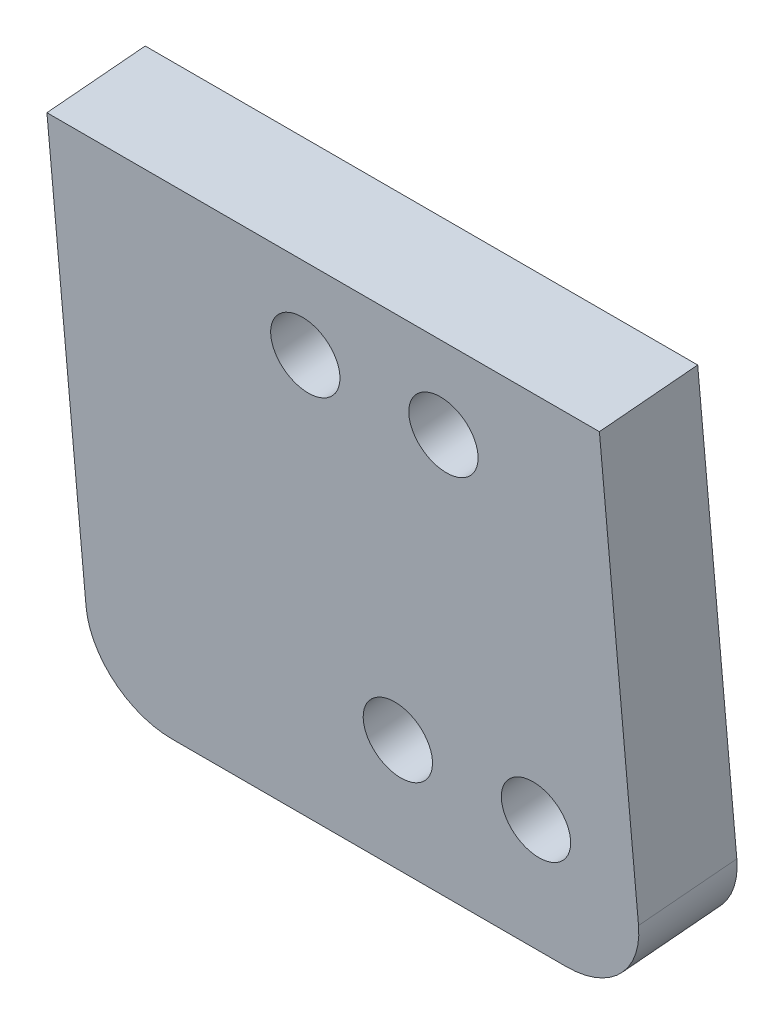
ISO-10303-21;
HEADER;
FILE_DESCRIPTION(('STEP AP214'),'2;1');
FILE_NAME('part.step','',(''),(''),'','','');
FILE_SCHEMA(('AUTOMOTIVE_DESIGN { 1 0 10303 214 1 1 1 1 }'));
ENDSEC;
DATA;
#1=APPLICATION_CONTEXT('core data for automotive mechanical design processes');
#2=APPLICATION_PROTOCOL_DEFINITION('international standard','automotive_design',2000,#1);
#3=PRODUCT_CONTEXT('',#1,'mechanical');
#4=PRODUCT('Part','Part','',(#3));
#5=PRODUCT_RELATED_PRODUCT_CATEGORY('part','',(#4));
#6=PRODUCT_DEFINITION_FORMATION('','',#4);
#7=PRODUCT_DEFINITION_CONTEXT('part definition',#1,'design');
#8=PRODUCT_DEFINITION('design','',#6,#7);
#9=PRODUCT_DEFINITION_SHAPE('','',#8);
#10=(LENGTH_UNIT() NAMED_UNIT(*) SI_UNIT(.MILLI.,.METRE.));
#11=(NAMED_UNIT(*) PLANE_ANGLE_UNIT() SI_UNIT($,.RADIAN.));
#12=(NAMED_UNIT(*) SI_UNIT($,.STERADIAN.) SOLID_ANGLE_UNIT());
#13=UNCERTAINTY_MEASURE_WITH_UNIT(LENGTH_MEASURE(1.E-05),#10,'distance_accuracy_value','');
#14=(GEOMETRIC_REPRESENTATION_CONTEXT(3) GLOBAL_UNCERTAINTY_ASSIGNED_CONTEXT((#13)) GLOBAL_UNIT_ASSIGNED_CONTEXT((#10,
#11,#12)) REPRESENTATION_CONTEXT('',''));
#15=CARTESIAN_POINT('',(0.,0.,0.));
#16=DIRECTION('',(0.,0.,1.));
#17=DIRECTION('',(1.,0.,0.));
#18=AXIS2_PLACEMENT_3D('',#15,#16,#17);
#19=CARTESIAN_POINT('',(-9.39850038185257,-99.6092322077506,29.3696279563749));
#20=DIRECTION('',(0.,0.996194698091746,0.087155742747658));
#21=DIRECTION('',(0.,-0.087155742747658,0.996194698091746));
#22=AXIS2_PLACEMENT_3D('',#19,#20,#21);
#23=PLANE('',#22);
#24=DIRECTION('',(1.,0.,0.));
#25=VECTOR('',#24,1.);
#26=CARTESIAN_POINT('',(-34.0999576101563,-100.480789635227,39.3315749372924));
#27=LINE('',#26,#25);
#28=CARTESIAN_POINT('',(-80.0899576101563,-100.480789635227,39.3315749372924));
#29=VERTEX_POINT('',#28);
#30=CARTESIAN_POINT('',(-24.0999576101563,-100.480789635227,39.3315749372924));
#31=VERTEX_POINT('',#30);
#32=EDGE_CURVE('E119',#29,#31,#27,.T.);
#33=ORIENTED_EDGE('',*,*,#32,.T.);
#34=DIRECTION('',(0.,0.087155742747658,-0.996194698091746));
#35=VECTOR('',#34,1.);
#36=CARTESIAN_POINT('',(-24.0999576101563,-100.480789635227,39.3315749372924));
#37=LINE('',#36,#35);
#38=CARTESIAN_POINT('',(-24.0999576101563,-99.6092322077506,29.3696279563749));
#39=VERTEX_POINT('',#38);
#40=EDGE_CURVE('E116',#31,#39,#37,.T.);
#41=ORIENTED_EDGE('',*,*,#40,.T.);
#42=DIRECTION('',(1.,0.,0.));
#43=VECTOR('',#42,1.);
#44=CARTESIAN_POINT('',(-34.0999576101563,-99.6092322077506,29.3696279563749));
#45=LINE('',#44,#43);
#46=CARTESIAN_POINT('',(-80.0899576101563,-99.6092322077506,29.3696279563749));
#47=VERTEX_POINT('',#46);
#48=EDGE_CURVE('E102',#47,#39,#45,.T.);
#49=ORIENTED_EDGE('',*,*,#48,.F.);
#50=DIRECTION('',(0.,-0.087155742747658,0.996194698091746));
#51=VECTOR('',#50,1.);
#52=CARTESIAN_POINT('',(-80.0899576101563,-100.480789635227,39.3315749372924));
#53=LINE('',#52,#51);
#54=EDGE_CURVE('E114',#47,#29,#53,.T.);
#55=ORIENTED_EDGE('',*,*,#54,.T.);
#56=EDGE_LOOP('',(#33,#41,#49,#55));
#57=FACE_BOUND('',#56,.T.);
#58=ADVANCED_FACE('F41',(#57),#23,.T.);
#59=CARTESIAN_POINT('',(-34.0999576101563,-141.324772256989,35.7581894846384));
#60=DIRECTION('',(0.,0.087155742747658,-0.996194698091746));
#61=DIRECTION('',(-1.,0.,0.));
#62=AXIS2_PLACEMENT_3D('',#59,#60,#61);
#63=PLANE('',#62);
#64=CARTESIAN_POINT('',(-48.0999576101563,-141.324772256989,35.7581894846384));
#65=DIRECTION('',(0.,-0.087155742747658,0.996194698091746));
#66=DIRECTION('',(1.,0.,0.));
#67=AXIS2_PLACEMENT_3D('',#64,#65,#66);
#68=CIRCLE('',#67,3.5);
#69=CARTESIAN_POINT('',(-44.5999576101563,-141.324772256989,35.7581894846384));
#70=VERTEX_POINT('',#69);
#71=EDGE_CURVE('E50',#70,#70,#68,.T.);
#72=ORIENTED_EDGE('',*,*,#71,.F.);
#73=EDGE_LOOP('',(#72));
#74=FACE_BOUND('',#73,.T.);
#75=CARTESIAN_POINT('',(-54.6899576101563,-109.446541918053,38.5471732525635));
#76=DIRECTION('',(0.,-0.087155742747658,0.996194698091746));
#77=DIRECTION('',(1.,0.,0.));
#78=AXIS2_PLACEMENT_3D('',#75,#76,#77);
#79=CIRCLE('',#78,3.5);
#80=CARTESIAN_POINT('',(-51.1899576101563,-109.446541918053,38.5471732525635));
#81=VERTEX_POINT('',#80);
#82=EDGE_CURVE('E147',#81,#81,#79,.T.);
#83=ORIENTED_EDGE('',*,*,#82,.F.);
#84=EDGE_LOOP('',(#83));
#85=FACE_BOUND('',#84,.T.);
#86=CARTESIAN_POINT('',(-40.6899576101563,-109.446541918053,38.5471732525635));
#87=DIRECTION('',(0.,-0.087155742747658,0.996194698091746));
#88=DIRECTION('',(1.,0.,0.));
#89=AXIS2_PLACEMENT_3D('',#86,#87,#88);
#90=CIRCLE('',#89,3.5);
#91=CARTESIAN_POINT('',(-37.1899576101563,-109.446541918053,38.5471732525635));
#92=VERTEX_POINT('',#91);
#93=EDGE_CURVE('E140',#92,#92,#90,.T.);
#94=ORIENTED_EDGE('',*,*,#93,.F.);
#95=EDGE_LOOP('',(#94));
#96=FACE_BOUND('',#95,.T.);
#97=CARTESIAN_POINT('',(-34.0999576101563,-141.324772256989,35.7581894846384));
#98=DIRECTION('',(0.,-0.087155742747658,0.996194698091746));
#99=DIRECTION('',(1.,0.,0.));
#100=AXIS2_PLACEMENT_3D('',#97,#98,#99);
#101=CIRCLE('',#100,3.5);
#102=CARTESIAN_POINT('',(-30.5999576101563,-141.324772256989,35.7581894846384));
#103=VERTEX_POINT('',#102);
#104=EDGE_CURVE('E141',#103,#103,#101,.T.);
#105=ORIENTED_EDGE('',*,*,#104,.F.);
#106=EDGE_LOOP('',(#105));
#107=FACE_BOUND('',#106,.T.);
#108=ORIENTED_EDGE('',*,*,#32,.F.);
#109=DIRECTION('',(0.,-0.996194698091746,-0.087155742747658));
#110=VECTOR('',#109,1.);
#111=CARTESIAN_POINT('',(-80.0899576101563,-153.777205983136,34.6687427002927));
#112=LINE('',#111,#110);
#113=CARTESIAN_POINT('',(-80.0899576101563,-145.807648398402,35.365988642274));
#114=VERTEX_POINT('',#113);
#115=EDGE_CURVE('E122',#29,#114,#112,.T.);
#116=ORIENTED_EDGE('',*,*,#115,.T.);
#117=CARTESIAN_POINT('',(-72.0899576101563,-145.807648398402,35.365988642274));
#118=DIRECTION('',(0.,0.087155742747658,-0.996194698091746));
#119=DIRECTION('',(-1.,0.,0.));
#120=AXIS2_PLACEMENT_3D('',#117,#118,#119);
#121=CIRCLE('',#120,8.);
#122=CARTESIAN_POINT('',(-72.0899576101563,-153.777205983136,34.6687427002927));
#123=VERTEX_POINT('',#122);
#124=EDGE_CURVE('E168',#114,#123,#121,.F.);
#125=ORIENTED_EDGE('',*,*,#124,.T.);
#126=DIRECTION('',(1.,0.,0.));
#127=VECTOR('',#126,1.);
#128=CARTESIAN_POINT('',(-24.0999576101563,-153.777205983136,34.6687427002927));
#129=LINE('',#128,#127);
#130=CARTESIAN_POINT('',(-32.0999576101563,-153.777205983136,34.6687427002927));
#131=VERTEX_POINT('',#130);
#132=EDGE_CURVE('E110',#123,#131,#129,.T.);
#133=ORIENTED_EDGE('',*,*,#132,.T.);
#134=CARTESIAN_POINT('',(-32.0999576101563,-145.807648398402,35.3659886422739));
#135=DIRECTION('',(0.,0.087155742747658,-0.996194698091746));
#136=DIRECTION('',(-1.,0.,0.));
#137=AXIS2_PLACEMENT_3D('',#134,#135,#136);
#138=CIRCLE('',#137,8.);
#139=CARTESIAN_POINT('',(-24.0999576101563,-145.807648398402,35.3659886422739));
#140=VERTEX_POINT('',#139);
#141=EDGE_CURVE('E66',#131,#140,#138,.F.);
#142=ORIENTED_EDGE('',*,*,#141,.T.);
#143=DIRECTION('',(0.,0.996194698091746,0.087155742747658));
#144=VECTOR('',#143,1.);
#145=CARTESIAN_POINT('',(-24.0999576101563,-66.2116920208711,42.3297324878118));
#146=LINE('',#145,#144);
#147=EDGE_CURVE('E129',#140,#31,#146,.T.);
#148=ORIENTED_EDGE('',*,*,#147,.T.);
#149=EDGE_LOOP('',(#108,#116,#125,#133,#142,#148));
#150=FACE_BOUND('',#149,.T.);
#151=ADVANCED_FACE('F179',(#74,#85,#96,#107,#150),#63,.F.);
#152=CARTESIAN_POINT('',(-34.0999576101563,-140.453214829512,25.796242503721));
#153=DIRECTION('',(0.,0.087155742747658,-0.996194698091746));
#154=DIRECTION('',(-1.,0.,0.));
#155=AXIS2_PLACEMENT_3D('',#152,#153,#154);
#156=PLANE('',#155);
#157=CARTESIAN_POINT('',(-48.0999576101563,-140.453214829512,25.796242503721));
#158=DIRECTION('',(0.,-0.087155742747658,0.996194698091746));
#159=DIRECTION('',(1.,0.,0.));
#160=AXIS2_PLACEMENT_3D('',#157,#158,#159);
#161=CIRCLE('',#160,3.5);
#162=CARTESIAN_POINT('',(-44.5999576101563,-140.453214829512,25.796242503721));
#163=VERTEX_POINT('',#162);
#164=EDGE_CURVE('E11',#163,#163,#161,.T.);
#165=ORIENTED_EDGE('',*,*,#164,.T.);
#166=EDGE_LOOP('',(#165));
#167=FACE_BOUND('',#166,.T.);
#168=CARTESIAN_POINT('',(-40.6899576101563,-108.574984490576,28.585226271646));
#169=DIRECTION('',(0.,-0.087155742747658,0.996194698091746));
#170=DIRECTION('',(1.,0.,0.));
#171=AXIS2_PLACEMENT_3D('',#168,#169,#170);
#172=CIRCLE('',#171,3.5);
#173=CARTESIAN_POINT('',(-37.1899576101563,-108.574984490576,28.585226271646));
#174=VERTEX_POINT('',#173);
#175=EDGE_CURVE('E144',#174,#174,#172,.T.);
#176=ORIENTED_EDGE('',*,*,#175,.T.);
#177=EDGE_LOOP('',(#176));
#178=FACE_BOUND('',#177,.T.);
#179=CARTESIAN_POINT('',(-34.0999576101563,-140.453214829512,25.796242503721));
#180=DIRECTION('',(0.,-0.087155742747658,0.996194698091746));
#181=DIRECTION('',(1.,0.,0.));
#182=AXIS2_PLACEMENT_3D('',#179,#180,#181);
#183=CIRCLE('',#182,3.5);
#184=CARTESIAN_POINT('',(-30.5999576101563,-140.453214829512,25.796242503721));
#185=VERTEX_POINT('',#184);
#186=EDGE_CURVE('E137',#185,#185,#183,.T.);
#187=ORIENTED_EDGE('',*,*,#186,.T.);
#188=EDGE_LOOP('',(#187));
#189=FACE_BOUND('',#188,.T.);
#190=CARTESIAN_POINT('',(-54.6899576101563,-108.574984490576,28.585226271646));
#191=DIRECTION('',(0.,-0.087155742747658,0.996194698091746));
#192=DIRECTION('',(1.,0.,0.));
#193=AXIS2_PLACEMENT_3D('',#190,#191,#192);
#194=CIRCLE('',#193,3.5);
#195=CARTESIAN_POINT('',(-51.1899576101563,-108.574984490576,28.585226271646));
#196=VERTEX_POINT('',#195);
#197=EDGE_CURVE('E150',#196,#196,#194,.T.);
#198=ORIENTED_EDGE('',*,*,#197,.T.);
#199=EDGE_LOOP('',(#198));
#200=FACE_BOUND('',#199,.T.);
#201=DIRECTION('',(0.,-0.996194698091746,-0.087155742747658));
#202=VECTOR('',#201,1.);
#203=CARTESIAN_POINT('',(-80.0899576101563,-152.905648555659,24.7067957193752));
#204=LINE('',#203,#202);
#205=CARTESIAN_POINT('',(-80.0899576101563,-144.936090970925,25.4040416613565));
#206=VERTEX_POINT('',#205);
#207=EDGE_CURVE('E98',#47,#206,#204,.T.);
#208=ORIENTED_EDGE('',*,*,#207,.F.);
#209=ORIENTED_EDGE('',*,*,#48,.T.);
#210=DIRECTION('',(0.,0.996194698091746,0.087155742747658));
#211=VECTOR('',#210,1.);
#212=CARTESIAN_POINT('',(-24.0999576101563,-65.3401345933945,32.3677855068944));
#213=LINE('',#212,#211);
#214=CARTESIAN_POINT('',(-24.0999576101563,-144.936090970925,25.4040416613565));
#215=VERTEX_POINT('',#214);
#216=EDGE_CURVE('E45',#215,#39,#213,.T.);
#217=ORIENTED_EDGE('',*,*,#216,.F.);
#218=CARTESIAN_POINT('',(-32.0999576101563,-144.936090970925,25.4040416613565));
#219=DIRECTION('',(0.,0.087155742747658,-0.996194698091746));
#220=DIRECTION('',(-1.,0.,0.));
#221=AXIS2_PLACEMENT_3D('',#218,#219,#220);
#222=CIRCLE('',#221,8.);
#223=CARTESIAN_POINT('',(-32.0999576101563,-152.905648555659,24.7067957193752));
#224=VERTEX_POINT('',#223);
#225=EDGE_CURVE('E58',#215,#224,#222,.T.);
#226=ORIENTED_EDGE('',*,*,#225,.T.);
#227=DIRECTION('',(1.,0.,0.));
#228=VECTOR('',#227,1.);
#229=CARTESIAN_POINT('',(-24.0999576101563,-152.905648555659,24.7067957193752));
#230=LINE('',#229,#228);
#231=CARTESIAN_POINT('',(-72.0899576101563,-152.905648555659,24.7067957193752));
#232=VERTEX_POINT('',#231);
#233=EDGE_CURVE('E135',#232,#224,#230,.T.);
#234=ORIENTED_EDGE('',*,*,#233,.F.);
#235=CARTESIAN_POINT('',(-72.0899576101563,-144.936090970925,25.4040416613565));
#236=DIRECTION('',(0.,0.087155742747658,-0.996194698091746));
#237=DIRECTION('',(-1.,0.,0.));
#238=AXIS2_PLACEMENT_3D('',#235,#236,#237);
#239=CIRCLE('',#238,8.);
#240=EDGE_CURVE('E105',#232,#206,#239,.T.);
#241=ORIENTED_EDGE('',*,*,#240,.T.);
#242=EDGE_LOOP('',(#208,#209,#217,#226,#234,#241));
#243=FACE_BOUND('',#242,.T.);
#244=ADVANCED_FACE('F100',(#167,#178,#189,#200,#243),#156,.T.);
#245=CARTESIAN_POINT('',(-24.0999576101563,-66.2116920208711,42.3297324878118));
#246=DIRECTION('',(-1.,0.,0.));
#247=DIRECTION('',(0.,-0.996194698091746,-0.087155742747658));
#248=AXIS2_PLACEMENT_3D('',#245,#246,#247);
#249=PLANE('',#248);
#250=ORIENTED_EDGE('',*,*,#40,.F.);
#251=ORIENTED_EDGE('',*,*,#147,.F.);
#252=DIRECTION('',(0.,0.087155742747658,-0.996194698091746));
#253=VECTOR('',#252,1.);
#254=CARTESIAN_POINT('',(-24.0999576101563,-145.807648398402,35.3659886422739));
#255=LINE('',#254,#253);
#256=EDGE_CURVE('E130',#140,#215,#255,.T.);
#257=ORIENTED_EDGE('',*,*,#256,.T.);
#258=ORIENTED_EDGE('',*,*,#216,.T.);
#259=EDGE_LOOP('',(#250,#251,#257,#258));
#260=FACE_BOUND('',#259,.T.);
#261=ADVANCED_FACE('F43',(#260),#249,.F.);
#262=CARTESIAN_POINT('',(-80.0899576101563,-153.777205983136,34.6687427002927));
#263=DIRECTION('',(1.,0.,0.));
#264=DIRECTION('',(0.,0.087155742747658,-0.996194698091746));
#265=AXIS2_PLACEMENT_3D('',#262,#263,#264);
#266=PLANE('',#265);
#267=ORIENTED_EDGE('',*,*,#54,.F.);
#268=ORIENTED_EDGE('',*,*,#207,.T.);
#269=DIRECTION('',(0.,0.087155742747658,-0.996194698091746));
#270=VECTOR('',#269,1.);
#271=CARTESIAN_POINT('',(-80.0899576101563,-145.807648398402,35.365988642274));
#272=LINE('',#271,#270);
#273=EDGE_CURVE('E118',#206,#114,#272,.F.);
#274=ORIENTED_EDGE('',*,*,#273,.T.);
#275=ORIENTED_EDGE('',*,*,#115,.F.);
#276=EDGE_LOOP('',(#267,#268,#274,#275));
#277=FACE_BOUND('',#276,.T.);
#278=ADVANCED_FACE('F121',(#277),#266,.F.);
#279=CARTESIAN_POINT('',(-24.0999576101563,-153.777205983136,34.6687427002927));
#280=DIRECTION('',(0.,0.996194698091746,0.087155742747658));
#281=DIRECTION('',(0.,-0.087155742747658,0.996194698091746));
#282=AXIS2_PLACEMENT_3D('',#279,#280,#281);
#283=PLANE('',#282);
#284=ORIENTED_EDGE('',*,*,#233,.T.);
#285=DIRECTION('',(0.,0.087155742747658,-0.996194698091746));
#286=VECTOR('',#285,1.);
#287=CARTESIAN_POINT('',(-32.0999576101563,-153.777205983136,34.6687427002927));
#288=LINE('',#287,#286);
#289=EDGE_CURVE('E164',#224,#131,#288,.F.);
#290=ORIENTED_EDGE('',*,*,#289,.T.);
#291=ORIENTED_EDGE('',*,*,#132,.F.);
#292=DIRECTION('',(0.,0.087155742747658,-0.996194698091746));
#293=VECTOR('',#292,1.);
#294=CARTESIAN_POINT('',(-72.0899576101563,-153.777205983136,34.6687427002927));
#295=LINE('',#294,#293);
#296=EDGE_CURVE('E166',#123,#232,#295,.T.);
#297=ORIENTED_EDGE('',*,*,#296,.T.);
#298=EDGE_LOOP('',(#284,#290,#291,#297));
#299=FACE_BOUND('',#298,.T.);
#300=ADVANCED_FACE('F163',(#299),#283,.F.);
#301=CARTESIAN_POINT('',(-34.0999576101563,-141.324772256989,35.7581894846384));
#302=DIRECTION('',(0.,0.087155742747658,-0.996194698091746));
#303=DIRECTION('',(-1.,0.,0.));
#304=AXIS2_PLACEMENT_3D('',#301,#302,#303);
#305=CYLINDRICAL_SURFACE('',#304,3.5);
#306=ORIENTED_EDGE('',*,*,#104,.T.);
#307=EDGE_LOOP('',(#306));
#308=FACE_BOUND('',#307,.T.);
#309=ORIENTED_EDGE('',*,*,#186,.F.);
#310=EDGE_LOOP('',(#309));
#311=FACE_BOUND('',#310,.T.);
#312=ADVANCED_FACE('F198',(#308,#311),#305,.F.);
#313=CARTESIAN_POINT('',(-40.6899576101563,-109.446541918053,38.5471732525635));
#314=DIRECTION('',(0.,0.087155742747658,-0.996194698091746));
#315=DIRECTION('',(-1.,0.,0.));
#316=AXIS2_PLACEMENT_3D('',#313,#314,#315);
#317=CYLINDRICAL_SURFACE('',#316,3.5);
#318=ORIENTED_EDGE('',*,*,#93,.T.);
#319=EDGE_LOOP('',(#318));
#320=FACE_BOUND('',#319,.T.);
#321=ORIENTED_EDGE('',*,*,#175,.F.);
#322=EDGE_LOOP('',(#321));
#323=FACE_BOUND('',#322,.T.);
#324=ADVANCED_FACE('F250',(#320,#323),#317,.F.);
#325=CARTESIAN_POINT('',(-54.6899576101563,-109.446541918053,38.5471732525635));
#326=DIRECTION('',(0.,0.087155742747658,-0.996194698091746));
#327=DIRECTION('',(-1.,0.,0.));
#328=AXIS2_PLACEMENT_3D('',#325,#326,#327);
#329=CYLINDRICAL_SURFACE('',#328,3.5);
#330=ORIENTED_EDGE('',*,*,#82,.T.);
#331=EDGE_LOOP('',(#330));
#332=FACE_BOUND('',#331,.T.);
#333=ORIENTED_EDGE('',*,*,#197,.F.);
#334=EDGE_LOOP('',(#333));
#335=FACE_BOUND('',#334,.T.);
#336=ADVANCED_FACE('F242',(#332,#335),#329,.F.);
#337=CARTESIAN_POINT('',(-48.0999576101563,-141.324772256989,35.7581894846384));
#338=DIRECTION('',(0.,0.087155742747658,-0.996194698091746));
#339=DIRECTION('',(-1.,0.,0.));
#340=AXIS2_PLACEMENT_3D('',#337,#338,#339);
#341=CYLINDRICAL_SURFACE('',#340,3.5);
#342=ORIENTED_EDGE('',*,*,#71,.T.);
#343=EDGE_LOOP('',(#342));
#344=FACE_BOUND('',#343,.T.);
#345=ORIENTED_EDGE('',*,*,#164,.F.);
#346=EDGE_LOOP('',(#345));
#347=FACE_BOUND('',#346,.T.);
#348=ADVANCED_FACE('F234',(#344,#347),#341,.F.);
#349=CARTESIAN_POINT('',(-32.0999576101563,-145.807648398402,35.3659886422739));
#350=DIRECTION('',(0.,0.087155742747658,-0.996194698091746));
#351=DIRECTION('',(-1.,0.,0.));
#352=AXIS2_PLACEMENT_3D('',#349,#350,#351);
#353=CYLINDRICAL_SURFACE('',#352,8.);
#354=ORIENTED_EDGE('',*,*,#141,.F.);
#355=ORIENTED_EDGE('',*,*,#289,.F.);
#356=ORIENTED_EDGE('',*,*,#225,.F.);
#357=ORIENTED_EDGE('',*,*,#256,.F.);
#358=EDGE_LOOP('',(#354,#355,#356,#357));
#359=FACE_BOUND('',#358,.T.);
#360=ADVANCED_FACE('F167',(#359),#353,.T.);
#361=CARTESIAN_POINT('',(-72.0899576101563,-145.807648398402,35.365988642274));
#362=DIRECTION('',(0.,0.087155742747658,-0.996194698091746));
#363=DIRECTION('',(-1.,0.,0.));
#364=AXIS2_PLACEMENT_3D('',#361,#362,#363);
#365=CYLINDRICAL_SURFACE('',#364,8.);
#366=ORIENTED_EDGE('',*,*,#124,.F.);
#367=ORIENTED_EDGE('',*,*,#273,.F.);
#368=ORIENTED_EDGE('',*,*,#240,.F.);
#369=ORIENTED_EDGE('',*,*,#296,.F.);
#370=EDGE_LOOP('',(#366,#367,#368,#369));
#371=FACE_BOUND('',#370,.T.);
#372=ADVANCED_FACE('F178',(#371),#365,.T.);
#373=CLOSED_SHELL('',(#58,#151,#244,#261,#278,#300,#312,#324,#336,#348,#360,#372));
#374=MANIFOLD_SOLID_BREP('B2',#373);
#375=ADVANCED_BREP_SHAPE_REPRESENTATION('',(#18,#374),#14);
#376=SHAPE_DEFINITION_REPRESENTATION(#9,#375);
ENDSEC;
END-ISO-10303-21;
